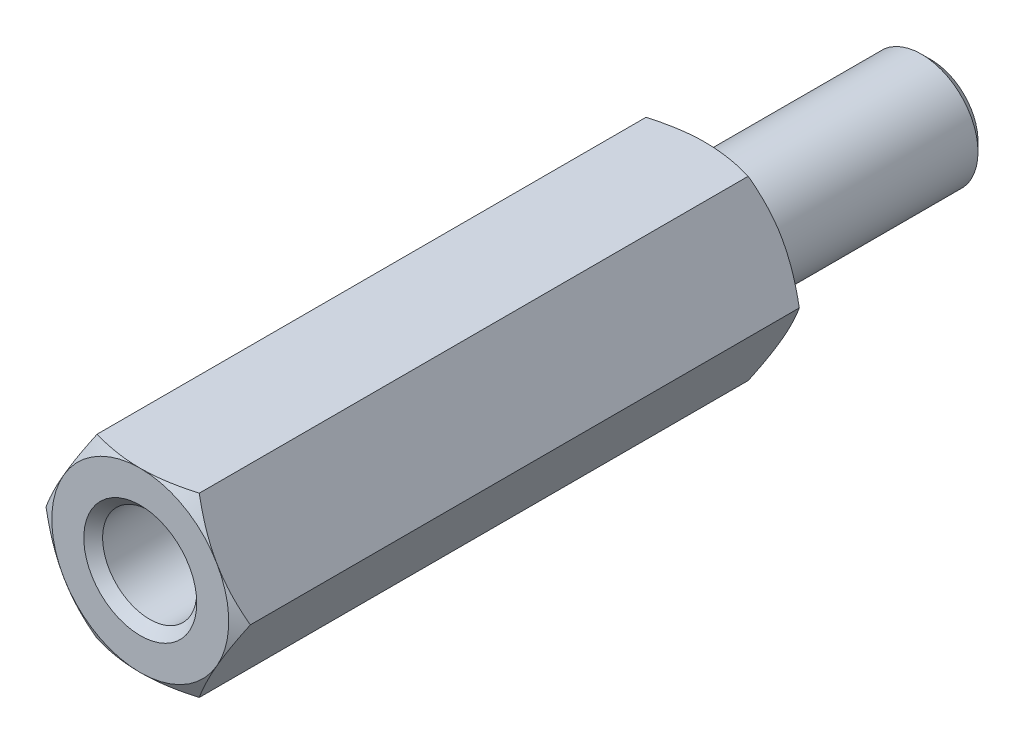
ISO-10303-21;
HEADER;
FILE_DESCRIPTION(('STEP AP214'),'2;1');
FILE_NAME('part.step','',(''),(''),'','','');
FILE_SCHEMA(('AUTOMOTIVE_DESIGN { 1 0 10303 214 1 1 1 1 }'));
ENDSEC;
DATA;
#1=APPLICATION_CONTEXT('core data for automotive mechanical design processes');
#2=APPLICATION_PROTOCOL_DEFINITION('international standard','automotive_design',2000,#1);
#3=PRODUCT_CONTEXT('',#1,'mechanical');
#4=PRODUCT('Part','Part','',(#3));
#5=PRODUCT_RELATED_PRODUCT_CATEGORY('part','',(#4));
#6=PRODUCT_DEFINITION_FORMATION('','',#4);
#7=PRODUCT_DEFINITION_CONTEXT('part definition',#1,'design');
#8=PRODUCT_DEFINITION('design','',#6,#7);
#9=PRODUCT_DEFINITION_SHAPE('','',#8);
#10=(LENGTH_UNIT() NAMED_UNIT(*) SI_UNIT(.MILLI.,.METRE.));
#11=(NAMED_UNIT(*) PLANE_ANGLE_UNIT() SI_UNIT($,.RADIAN.));
#12=(NAMED_UNIT(*) SI_UNIT($,.STERADIAN.) SOLID_ANGLE_UNIT());
#13=UNCERTAINTY_MEASURE_WITH_UNIT(LENGTH_MEASURE(1.E-05),#10,'distance_accuracy_value','');
#14=(GEOMETRIC_REPRESENTATION_CONTEXT(3) GLOBAL_UNCERTAINTY_ASSIGNED_CONTEXT((#13)) GLOBAL_UNIT_ASSIGNED_CONTEXT((#10,
#11,#12)) REPRESENTATION_CONTEXT('',''));
#15=CARTESIAN_POINT('',(0.,0.,0.));
#16=DIRECTION('',(0.,0.,1.));
#17=DIRECTION('',(1.,0.,0.));
#18=AXIS2_PLACEMENT_3D('',#15,#16,#17);
#19=CARTESIAN_POINT('',(0.,0.,15.));
#20=DIRECTION('',(0.,0.,1.));
#21=DIRECTION('',(1.,0.,0.));
#22=AXIS2_PLACEMENT_3D('',#19,#20,#21);
#23=CONICAL_SURFACE('',#22,1.5,0.785398163397448);
#24=CARTESIAN_POINT('',(0.,0.,15.));
#25=DIRECTION('',(0.,0.,-1.));
#26=DIRECTION('',(1.,0.,0.));
#27=AXIS2_PLACEMENT_3D('',#24,#25,#26);
#28=CIRCLE('',#27,1.5);
#29=CARTESIAN_POINT('',(1.5,0.,15.));
#30=VERTEX_POINT('',#29);
#31=EDGE_CURVE('E735',#30,#30,#28,.T.);
#32=ORIENTED_EDGE('',*,*,#31,.F.);
#33=EDGE_LOOP('',(#32));
#34=FACE_BOUND('',#33,.T.);
#35=CARTESIAN_POINT('',(0.,0.,14.75));
#36=DIRECTION('',(0.,0.,1.));
#37=DIRECTION('',(1.,0.,0.));
#38=AXIS2_PLACEMENT_3D('',#35,#36,#37);
#39=CIRCLE('',#38,1.25);
#40=CARTESIAN_POINT('',(1.25,0.,14.75));
#41=VERTEX_POINT('',#40);
#42=EDGE_CURVE('E11',#41,#41,#39,.T.);
#43=ORIENTED_EDGE('',*,*,#42,.F.);
#44=EDGE_LOOP('',(#43));
#45=FACE_BOUND('',#44,.T.);
#46=ADVANCED_FACE('F16',(#34,#45),#23,.F.);
#47=CARTESIAN_POINT('',(0.,0.,15.));
#48=DIRECTION('',(0.,0.,-1.));
#49=DIRECTION('',(0.,-1.,0.));
#50=AXIS2_PLACEMENT_3D('',#47,#48,#49);
#51=CYLINDRICAL_SURFACE('',#50,1.25);
#52=CARTESIAN_POINT('',(0.,0.,7.));
#53=DIRECTION('',(0.,0.,1.));
#54=DIRECTION('',(0.,-1.,0.));
#55=AXIS2_PLACEMENT_3D('',#52,#53,#54);
#56=CIRCLE('',#55,1.25);
#57=CARTESIAN_POINT('',(0.,-1.25,7.));
#58=VERTEX_POINT('',#57);
#59=EDGE_CURVE('E27',#58,#58,#56,.T.);
#60=ORIENTED_EDGE('',*,*,#59,.F.);
#61=EDGE_LOOP('',(#60));
#62=FACE_BOUND('',#61,.T.);
#63=ORIENTED_EDGE('',*,*,#42,.T.);
#64=EDGE_LOOP('',(#63));
#65=FACE_BOUND('',#64,.T.);
#66=ADVANCED_FACE('F831',(#62,#65),#51,.F.);
#67=CARTESIAN_POINT('',(0.,0.,7.));
#68=DIRECTION('',(0.,0.,-1.));
#69=DIRECTION('',(0.,-1.,0.));
#70=AXIS2_PLACEMENT_3D('',#67,#68,#69);
#71=PLANE('',#70);
#72=ORIENTED_EDGE('',*,*,#59,.T.);
#73=EDGE_LOOP('',(#72));
#74=FACE_BOUND('',#73,.T.);
#75=ADVANCED_FACE('F836',(#74),#71,.F.);
#76=CARTESIAN_POINT('',(0.,0.,0.));
#77=DIRECTION('',(0.,0.,1.));
#78=DIRECTION('',(1.,0.,0.));
#79=AXIS2_PLACEMENT_3D('',#76,#77,#78);
#80=PLANE('',#79);
#81=CARTESIAN_POINT('',(0.,0.,0.));
#82=DIRECTION('',(0.,0.,1.));
#83=DIRECTION('',(1.,0.,0.));
#84=AXIS2_PLACEMENT_3D('',#81,#82,#83);
#85=CIRCLE('',#84,2.35);
#86=CARTESIAN_POINT('',(2.03515969889343,1.175,0.));
#87=VERTEX_POINT('',#86);
#88=CARTESIAN_POINT('',(0.,2.35,0.));
#89=VERTEX_POINT('',#88);
#90=EDGE_CURVE('E512',#87,#89,#85,.T.);
#91=ORIENTED_EDGE('',*,*,#90,.F.);
#92=CARTESIAN_POINT('',(0.,0.,0.));
#93=DIRECTION('',(0.,0.,1.));
#94=DIRECTION('',(1.,0.,0.));
#95=AXIS2_PLACEMENT_3D('',#92,#93,#94);
#96=CIRCLE('',#95,2.35);
#97=CARTESIAN_POINT('',(2.03515969889343,-1.175,0.));
#98=VERTEX_POINT('',#97);
#99=EDGE_CURVE('E520',#98,#87,#96,.T.);
#100=ORIENTED_EDGE('',*,*,#99,.F.);
#101=CARTESIAN_POINT('',(0.,0.,0.));
#102=DIRECTION('',(0.,0.,1.));
#103=DIRECTION('',(1.,0.,0.));
#104=AXIS2_PLACEMENT_3D('',#101,#102,#103);
#105=CIRCLE('',#104,2.35);
#106=CARTESIAN_POINT('',(0.,-2.35,0.));
#107=VERTEX_POINT('',#106);
#108=EDGE_CURVE('E587',#107,#98,#105,.T.);
#109=ORIENTED_EDGE('',*,*,#108,.F.);
#110=CARTESIAN_POINT('',(0.,0.,0.));
#111=DIRECTION('',(0.,0.,1.));
#112=DIRECTION('',(1.,0.,0.));
#113=AXIS2_PLACEMENT_3D('',#110,#111,#112);
#114=CIRCLE('',#113,2.35);
#115=CARTESIAN_POINT('',(-2.03515969889343,-1.175,0.));
#116=VERTEX_POINT('',#115);
#117=EDGE_CURVE('E168',#116,#107,#114,.T.);
#118=ORIENTED_EDGE('',*,*,#117,.F.);
#119=CARTESIAN_POINT('',(0.,0.,0.));
#120=DIRECTION('',(0.,0.,1.));
#121=DIRECTION('',(1.,0.,0.));
#122=AXIS2_PLACEMENT_3D('',#119,#120,#121);
#123=CIRCLE('',#122,2.35);
#124=CARTESIAN_POINT('',(-2.03515969889343,1.175,0.));
#125=VERTEX_POINT('',#124);
#126=EDGE_CURVE('E600',#125,#116,#123,.T.);
#127=ORIENTED_EDGE('',*,*,#126,.F.);
#128=CARTESIAN_POINT('',(0.,0.,0.));
#129=DIRECTION('',(0.,0.,1.));
#130=DIRECTION('',(1.,0.,0.));
#131=AXIS2_PLACEMENT_3D('',#128,#129,#130);
#132=CIRCLE('',#131,2.35);
#133=EDGE_CURVE('E521',#89,#125,#132,.T.);
#134=ORIENTED_EDGE('',*,*,#133,.F.);
#135=EDGE_LOOP('',(#91,#100,#109,#118,#127,#134));
#136=FACE_BOUND('',#135,.T.);
#137=CARTESIAN_POINT('',(0.,0.,0.));
#138=DIRECTION('',(0.,0.,-1.));
#139=DIRECTION('',(1.,0.,0.));
#140=AXIS2_PLACEMENT_3D('',#137,#138,#139);
#141=CIRCLE('',#140,1.5);
#142=CARTESIAN_POINT('',(1.5,0.,0.));
#143=VERTEX_POINT('',#142);
#144=EDGE_CURVE('E686',#143,#143,#141,.T.);
#145=ORIENTED_EDGE('',*,*,#144,.F.);
#146=EDGE_LOOP('',(#145));
#147=FACE_BOUND('',#146,.T.);
#148=ADVANCED_FACE('F647',(#136,#147),#80,.F.);
#149=CARTESIAN_POINT('',(0.,0.,-6.));
#150=DIRECTION('',(0.,0.,1.));
#151=DIRECTION('',(1.,0.,0.));
#152=AXIS2_PLACEMENT_3D('',#149,#150,#151);
#153=CYLINDRICAL_SURFACE('',#152,1.5);
#154=ORIENTED_EDGE('',*,*,#144,.T.);
#155=EDGE_LOOP('',(#154));
#156=FACE_BOUND('',#155,.T.);
#157=CARTESIAN_POINT('',(0.,0.,-5.75));
#158=DIRECTION('',(0.,0.,1.));
#159=DIRECTION('',(-1.,0.,0.));
#160=AXIS2_PLACEMENT_3D('',#157,#158,#159);
#161=CIRCLE('',#160,1.5);
#162=CARTESIAN_POINT('',(-1.5,0.,-5.75));
#163=VERTEX_POINT('',#162);
#164=EDGE_CURVE('E689',#163,#163,#161,.T.);
#165=ORIENTED_EDGE('',*,*,#164,.T.);
#166=EDGE_LOOP('',(#165));
#167=FACE_BOUND('',#166,.T.);
#168=ADVANCED_FACE('F846',(#156,#167),#153,.T.);
#169=CARTESIAN_POINT('',(0.,0.,-6.));
#170=DIRECTION('',(0.,0.,1.));
#171=DIRECTION('',(1.,0.,0.));
#172=AXIS2_PLACEMENT_3D('',#169,#170,#171);
#173=CONICAL_SURFACE('',#172,1.25,0.785398163397448);
#174=CARTESIAN_POINT('',(0.,0.,-6.));
#175=DIRECTION('',(0.,0.,-1.));
#176=DIRECTION('',(-1.,0.,0.));
#177=AXIS2_PLACEMENT_3D('',#174,#175,#176);
#178=CIRCLE('',#177,1.25);
#179=CARTESIAN_POINT('',(-1.25,0.,-6.));
#180=VERTEX_POINT('',#179);
#181=EDGE_CURVE('E595',#180,#180,#178,.T.);
#182=ORIENTED_EDGE('',*,*,#181,.F.);
#183=EDGE_LOOP('',(#182));
#184=FACE_BOUND('',#183,.T.);
#185=ORIENTED_EDGE('',*,*,#164,.F.);
#186=EDGE_LOOP('',(#185));
#187=FACE_BOUND('',#186,.T.);
#188=ADVANCED_FACE('F848',(#184,#187),#173,.T.);
#189=CARTESIAN_POINT('',(0.,0.,-6.));
#190=DIRECTION('',(0.,0.,-1.));
#191=DIRECTION('',(0.,-1.,0.));
#192=AXIS2_PLACEMENT_3D('',#189,#190,#191);
#193=PLANE('',#192);
#194=ORIENTED_EDGE('',*,*,#181,.T.);
#195=EDGE_LOOP('',(#194));
#196=FACE_BOUND('',#195,.T.);
#197=ADVANCED_FACE('F578',(#196),#193,.T.);
#198=CARTESIAN_POINT('',(0.,0.,0.));
#199=DIRECTION('',(0.,0.,1.));
#200=DIRECTION('',(1.,0.,0.));
#201=AXIS2_PLACEMENT_3D('',#198,#199,#200);
#202=CONICAL_SURFACE('',#201,2.35,1.0471975511966);
#203=ORIENTED_EDGE('',*,*,#108,.T.);
#204=CARTESIAN_POINT('',(1.35677313259551,-2.35000000000019,0.209893534069571));
#205=CARTESIAN_POINT('',(1.72031939778416,-1.72031939779154,0.));
#206=CARTESIAN_POINT('',(2.03515969889343,-1.175,0.));
#207=B_SPLINE_CURVE_WITH_KNOTS('',2,(#204,#205,#206),.UNSPECIFIED.,.F.,.F.,(3,3),(0.,1.),.UNSPECIFIED.);
#208=CARTESIAN_POINT('',(1.35677313259562,-2.35,0.209893534071045));
#209=VERTEX_POINT('',#208);
#210=EDGE_CURVE('E556',#209,#98,#207,.T.);
#211=ORIENTED_EDGE('',*,*,#210,.F.);
#212=CARTESIAN_POINT('',(0.,-2.35,0.));
#213=CARTESIAN_POINT('',(0.629680602213305,-2.35,0.));
#214=CARTESIAN_POINT('',(1.35677313259563,-2.35,0.209893534071));
#215=B_SPLINE_CURVE_WITH_KNOTS('',2,(#212,#213,#214),.UNSPECIFIED.,.F.,.F.,(3,3),(0.,1.),.UNSPECIFIED.);
#216=EDGE_CURVE('E173',#107,#209,#215,.T.);
#217=ORIENTED_EDGE('',*,*,#216,.F.);
#218=EDGE_LOOP('',(#203,#211,#217));
#219=FACE_BOUND('',#218,.T.);
#220=ADVANCED_FACE('F569',(#219),#202,.T.);
#221=CARTESIAN_POINT('',(0.,0.,0.));
#222=DIRECTION('',(0.,0.,1.));
#223=DIRECTION('',(1.,0.,0.));
#224=AXIS2_PLACEMENT_3D('',#221,#222,#223);
#225=CONICAL_SURFACE('',#224,2.35,1.0471975511966);
#226=ORIENTED_EDGE('',*,*,#99,.T.);
#227=CARTESIAN_POINT('',(2.71354626519135,-1.81776656334133E-13,0.209893534069585));
#228=CARTESIAN_POINT('',(2.35000000000271,0.629680602208454,0.));
#229=CARTESIAN_POINT('',(2.03515969889343,1.175,0.));
#230=B_SPLINE_CURVE_WITH_KNOTS('',2,(#227,#228,#229),.UNSPECIFIED.,.F.,.F.,(3,3),(0.,1.),.UNSPECIFIED.);
#231=CARTESIAN_POINT('',(2.71354626519124,0.,0.209893534071045));
#232=VERTEX_POINT('',#231);
#233=EDGE_CURVE('E532',#232,#87,#230,.T.);
#234=ORIENTED_EDGE('',*,*,#233,.F.);
#235=CARTESIAN_POINT('',(2.03515969889343,-1.175,0.));
#236=CARTESIAN_POINT('',(2.35000000000138,-0.62968060221074,0.));
#237=CARTESIAN_POINT('',(2.7135462651913,1.06251812903579E-13,0.209893534070291));
#238=B_SPLINE_CURVE_WITH_KNOTS('',2,(#235,#236,#237),.UNSPECIFIED.,.F.,.F.,(3,3),(0.,1.),.UNSPECIFIED.);
#239=EDGE_CURVE('E174',#98,#232,#238,.T.);
#240=ORIENTED_EDGE('',*,*,#239,.F.);
#241=EDGE_LOOP('',(#226,#234,#240));
#242=FACE_BOUND('',#241,.T.);
#243=ADVANCED_FACE('F503',(#242),#225,.T.);
#244=CARTESIAN_POINT('',(0.,0.,0.));
#245=DIRECTION('',(0.,0.,1.));
#246=DIRECTION('',(1.,0.,0.));
#247=AXIS2_PLACEMENT_3D('',#244,#245,#246);
#248=CONICAL_SURFACE('',#247,2.35,1.0471975511966);
#249=ORIENTED_EDGE('',*,*,#90,.T.);
#250=CARTESIAN_POINT('',(1.35677313259561,2.35,0.209893534071031));
#251=CARTESIAN_POINT('',(0.6296806022132,2.35,0.));
#252=CARTESIAN_POINT('',(0.,2.35,0.));
#253=B_SPLINE_CURVE_WITH_KNOTS('',2,(#250,#251,#252),.UNSPECIFIED.,.F.,.F.,(3,3),(0.,1.),.UNSPECIFIED.);
#254=CARTESIAN_POINT('',(1.35677313259561,2.35,0.209893534071045));
#255=VERTEX_POINT('',#254);
#256=EDGE_CURVE('E489',#255,#89,#253,.T.);
#257=ORIENTED_EDGE('',*,*,#256,.F.);
#258=CARTESIAN_POINT('',(2.03515969889343,1.175,0.));
#259=CARTESIAN_POINT('',(1.72031939778547,1.72031939778927,0.));
#260=CARTESIAN_POINT('',(1.35677313259556,2.35000000000011,0.209893534070305));
#261=B_SPLINE_CURVE_WITH_KNOTS('',2,(#258,#259,#260),.UNSPECIFIED.,.F.,.F.,(3,3),(0.,1.),.UNSPECIFIED.);
#262=EDGE_CURVE('E533',#87,#255,#261,.T.);
#263=ORIENTED_EDGE('',*,*,#262,.F.);
#264=EDGE_LOOP('',(#249,#257,#263));
#265=FACE_BOUND('',#264,.T.);
#266=ADVANCED_FACE('F494',(#265),#248,.T.);
#267=CARTESIAN_POINT('',(0.,0.,0.));
#268=DIRECTION('',(0.,0.,1.));
#269=DIRECTION('',(1.,0.,0.));
#270=AXIS2_PLACEMENT_3D('',#267,#268,#269);
#271=CONICAL_SURFACE('',#270,2.35,1.0471975511966);
#272=ORIENTED_EDGE('',*,*,#133,.T.);
#273=CARTESIAN_POINT('',(-1.35677313259552,2.35000000000018,0.209893534069571));
#274=CARTESIAN_POINT('',(-1.72031939778415,1.72031939779155,0.));
#275=CARTESIAN_POINT('',(-2.03515969889343,1.175,0.));
#276=B_SPLINE_CURVE_WITH_KNOTS('',2,(#273,#274,#275),.UNSPECIFIED.,.F.,.F.,(3,3),(0.,1.),.UNSPECIFIED.);
#277=CARTESIAN_POINT('',(-1.35677313259562,2.35,0.209893534071045));
#278=VERTEX_POINT('',#277);
#279=EDGE_CURVE('E656',#278,#125,#276,.T.);
#280=ORIENTED_EDGE('',*,*,#279,.F.);
#281=CARTESIAN_POINT('',(0.,2.35,0.));
#282=CARTESIAN_POINT('',(-0.629680602213305,2.35,0.));
#283=CARTESIAN_POINT('',(-1.35677313259563,2.35,0.209893534071011));
#284=B_SPLINE_CURVE_WITH_KNOTS('',2,(#281,#282,#283),.UNSPECIFIED.,.F.,.F.,(3,3),(0.,1.),.UNSPECIFIED.);
#285=EDGE_CURVE('E542',#89,#278,#284,.T.);
#286=ORIENTED_EDGE('',*,*,#285,.F.);
#287=EDGE_LOOP('',(#272,#280,#286));
#288=FACE_BOUND('',#287,.T.);
#289=ADVANCED_FACE('F330',(#288),#271,.T.);
#290=CARTESIAN_POINT('',(0.,0.,0.));
#291=DIRECTION('',(0.,0.,1.));
#292=DIRECTION('',(1.,0.,0.));
#293=AXIS2_PLACEMENT_3D('',#290,#291,#292);
#294=CONICAL_SURFACE('',#293,2.35,1.0471975511966);
#295=ORIENTED_EDGE('',*,*,#126,.T.);
#296=CARTESIAN_POINT('',(-2.71354626519134,1.76378261404584E-13,0.209893534069571));
#297=CARTESIAN_POINT('',(-2.3500000000027,-0.629680602208452,0.));
#298=CARTESIAN_POINT('',(-2.03515969889343,-1.175,0.));
#299=B_SPLINE_CURVE_WITH_KNOTS('',2,(#296,#297,#298),.UNSPECIFIED.,.F.,.F.,(3,3),(0.,1.),.UNSPECIFIED.);
#300=CARTESIAN_POINT('',(-2.71354626519124,0.,0.209893534071045));
#301=VERTEX_POINT('',#300);
#302=EDGE_CURVE('E192',#301,#116,#299,.T.);
#303=ORIENTED_EDGE('',*,*,#302,.F.);
#304=CARTESIAN_POINT('',(-2.03515969889343,1.175,0.));
#305=CARTESIAN_POINT('',(-2.35000000000139,0.629680602210734,0.));
#306=CARTESIAN_POINT('',(-2.7135462651913,-1.07986536379556E-13,0.2098935340703));
#307=B_SPLINE_CURVE_WITH_KNOTS('',2,(#304,#305,#306),.UNSPECIFIED.,.F.,.F.,(3,3),(0.,1.),.UNSPECIFIED.);
#308=EDGE_CURVE('E527',#125,#301,#307,.T.);
#309=ORIENTED_EDGE('',*,*,#308,.F.);
#310=EDGE_LOOP('',(#295,#303,#309));
#311=FACE_BOUND('',#310,.T.);
#312=ADVANCED_FACE('F277',(#311),#294,.T.);
#313=CARTESIAN_POINT('',(0.,0.,0.));
#314=DIRECTION('',(0.,0.,1.));
#315=DIRECTION('',(1.,0.,0.));
#316=AXIS2_PLACEMENT_3D('',#313,#314,#315);
#317=CONICAL_SURFACE('',#316,2.35,1.0471975511966);
#318=CARTESIAN_POINT('',(-2.03515969889343,-1.175,0.));
#319=CARTESIAN_POINT('',(-1.72031939778547,-1.72031939778927,0.));
#320=CARTESIAN_POINT('',(-1.35677313259556,-2.35000000000011,0.209893534070291));
#321=B_SPLINE_CURVE_WITH_KNOTS('',2,(#318,#319,#320),.UNSPECIFIED.,.F.,.F.,(3,3),(0.,1.),.UNSPECIFIED.);
#322=CARTESIAN_POINT('',(-1.35677313259562,-2.35,0.209893534071047));
#323=VERTEX_POINT('',#322);
#324=EDGE_CURVE('E164',#116,#323,#321,.T.);
#325=ORIENTED_EDGE('',*,*,#324,.F.);
#326=ORIENTED_EDGE('',*,*,#117,.T.);
#327=CARTESIAN_POINT('',(-1.35677313259562,-2.35,0.209893534071031));
#328=CARTESIAN_POINT('',(-0.629680602213206,-2.35,0.));
#329=CARTESIAN_POINT('',(0.,-2.35,0.));
#330=B_SPLINE_CURVE_WITH_KNOTS('',2,(#327,#328,#329),.UNSPECIFIED.,.F.,.F.,(3,3),(0.,1.),.UNSPECIFIED.);
#331=EDGE_CURVE('E159',#323,#107,#330,.T.);
#332=ORIENTED_EDGE('',*,*,#331,.F.);
#333=EDGE_LOOP('',(#325,#326,#332));
#334=FACE_BOUND('',#333,.T.);
#335=ADVANCED_FACE('F162',(#334),#317,.T.);
#336=CARTESIAN_POINT('',(-1.35677313259562,-2.35,5.));
#337=DIRECTION('',(0.,1.,0.));
#338=DIRECTION('',(1.,0.,0.));
#339=AXIS2_PLACEMENT_3D('',#336,#337,#338);
#340=PLANE('',#339);
#341=DIRECTION('',(0.,0.,-1.));
#342=VECTOR('',#341,1.);
#343=CARTESIAN_POINT('',(-1.35677313259562,-2.35,5.));
#344=LINE('',#343,#342);
#345=CARTESIAN_POINT('',(-1.35677313259562,-2.35,14.790106465929));
#346=VERTEX_POINT('',#345);
#347=EDGE_CURVE('E178',#346,#323,#344,.T.);
#348=ORIENTED_EDGE('',*,*,#347,.T.);
#349=ORIENTED_EDGE('',*,*,#331,.T.);
#350=ORIENTED_EDGE('',*,*,#216,.T.);
#351=DIRECTION('',(0.,0.,-1.));
#352=VECTOR('',#351,1.);
#353=CARTESIAN_POINT('',(1.35677313259562,-2.35,5.));
#354=LINE('',#353,#352);
#355=CARTESIAN_POINT('',(1.35677313259562,-2.35,14.790106465929));
#356=VERTEX_POINT('',#355);
#357=EDGE_CURVE('E541',#356,#209,#354,.T.);
#358=ORIENTED_EDGE('',*,*,#357,.F.);
#359=CARTESIAN_POINT('',(0.,-2.35,15.));
#360=CARTESIAN_POINT('',(0.0569898805085818,-2.34998223790604,15.0000198621487));
#361=CARTESIAN_POINT('',(0.113979066153858,-2.34994616675174,14.9988345049703));
#362=CARTESIAN_POINT('',(0.227671429761785,-2.34989447859525,14.9940974313157));
#363=CARTESIAN_POINT('',(0.284374931900596,-2.34987879470469,14.9905535111894));
#364=CARTESIAN_POINT('',(0.398067480440072,-2.34992428082444,14.9811031222581));
#365=CARTESIAN_POINT('',(0.455054871097415,-2.34998610363658,14.975176875291));
#366=CARTESIAN_POINT('',(0.569866021918259,-2.35010138084254,14.9610034884358));
#367=CARTESIAN_POINT('',(0.627684426821159,-2.35015464858288,14.9527133521143));
#368=CARTESIAN_POINT('',(0.740520305213578,-2.35016236737531,14.9344713747374));
#369=CARTESIAN_POINT('',(0.795551814923057,-2.35012094711114,14.9246057630553));
#370=CARTESIAN_POINT('',(0.906033500923337,-2.35005435744373,14.9029375031044));
#371=CARTESIAN_POINT('',(0.961478714889878,-2.35002942425149,14.8911096146164));
#372=CARTESIAN_POINT('',(1.07310299823894,-2.34999878788455,14.8655358608681));
#373=CARTESIAN_POINT('',(1.12927423957828,-2.34999348370669,14.8517560519232));
#374=CARTESIAN_POINT('',(1.24263204165423,-2.34999227207601,14.8222834514747));
#375=CARTESIAN_POINT('',(1.29980833846896,-2.34999660573884,14.8065510839247));
#376=CARTESIAN_POINT('',(1.35677313259561,-2.34999999999997,14.790106465929));
#377=B_SPLINE_CURVE_WITH_KNOTS('',3,(#359,#360,#361,#362,#363,#364,#365,#366,#367,#368,#369,
#370,#371,#372,#373,#374,#375,#376),.UNSPECIFIED.,.F.,.F.,(4,2,2,2,2,2,2,2,4),(0.,
0.170955523729223,0.34134873358799,0.513186773818304,0.688375037220441,0.856070990715303,
1.02612027923544,1.19960772903592,1.3774841124385),.UNSPECIFIED.);
#378=CARTESIAN_POINT('',(0.,-2.35,15.));
#379=VERTEX_POINT('',#378);
#380=EDGE_CURVE('E681',#379,#356,#377,.T.);
#381=ORIENTED_EDGE('',*,*,#380,.F.);
#382=CARTESIAN_POINT('',(-1.35677313259561,-2.34999999999998,14.790106465929));
#383=CARTESIAN_POINT('',(-1.29981478304855,-2.34999664305614,14.806549214638));
#384=CARTESIAN_POINT('',(-1.24264490927598,-2.34999289152531,14.8222796016959));
#385=CARTESIAN_POINT('',(-1.12929545948309,-2.34999554718112,14.8517496514687));
#386=CARTESIAN_POINT('',(-1.07312611444837,-2.35000170675881,14.8655287635228));
#387=CARTESIAN_POINT('',(-0.961501458691434,-2.35003359497319,14.8911024366567));
#388=CARTESIAN_POINT('',(-0.906053944968671,-2.35005893485502,14.9029308079662));
#389=CARTESIAN_POINT('',(-0.795563946580114,-2.35012425670273,14.9246017739758));
#390=CARTESIAN_POINT('',(-0.740526396783754,-2.35016403226208,14.9344694678709));
#391=CARTESIAN_POINT('',(-0.627690730564334,-2.35015291056097,14.9527132960362));
#392=CARTESIAN_POINT('',(-0.569878646917285,-2.35009790445374,14.9610036376061));
#393=CARTESIAN_POINT('',(-0.455075905809175,-2.34998135958573,14.9751772222369));
#394=CARTESIAN_POINT('',(-0.398090586710543,-2.34991996527371,14.9811033215988));
#395=CARTESIAN_POINT('',(-0.284398021611257,-2.34987579485824,14.990553658474));
#396=CARTESIAN_POINT('',(-0.227692417034037,-2.34989236770654,14.9940975047175));
#397=CARTESIAN_POINT('',(-0.113991655127477,-2.34994553451344,14.9988346058795));
#398=CARTESIAN_POINT('',(-0.0569961663689094,-2.34998219583293,15.0000198897594));
#399=CARTESIAN_POINT('',(0.,-2.35,15.));
#400=B_SPLINE_CURVE_WITH_KNOTS('',3,(#382,#383,#384,#385,#386,#387,#388,#389,#390,#391,#392,
#393,#394,#395,#396,#397,#398,#399),.UNSPECIFIED.,.F.,.F.,(4,2,2,2,2,2,2,2,4),(0.,
0.17785623759356,0.351337661723348,0.521394024583748,0.689108930252408,0.864278498719589,
1.0361102777329,1.20650977089324,1.37748417764025),.UNSPECIFIED.);
#401=EDGE_CURVE('E181',#346,#379,#400,.T.);
#402=ORIENTED_EDGE('',*,*,#401,.F.);
#403=EDGE_LOOP('',(#348,#349,#350,#358,#381,#402));
#404=FACE_BOUND('',#403,.T.);
#405=ADVANCED_FACE('F179',(#404),#340,.F.);
#406=CARTESIAN_POINT('',(1.35677313259562,-2.35,5.));
#407=DIRECTION('',(-0.86602540378444,0.5,0.));
#408=DIRECTION('',(0.,0.,1.));
#409=AXIS2_PLACEMENT_3D('',#406,#407,#408);
#410=PLANE('',#409);
#411=ORIENTED_EDGE('',*,*,#357,.T.);
#412=ORIENTED_EDGE('',*,*,#210,.T.);
#413=ORIENTED_EDGE('',*,*,#239,.T.);
#414=DIRECTION('',(0.,0.,-1.));
#415=VECTOR('',#414,1.);
#416=CARTESIAN_POINT('',(2.71354626519124,0.,5.));
#417=LINE('',#416,#415);
#418=CARTESIAN_POINT('',(2.71354626519124,0.,14.790106465929));
#419=VERTEX_POINT('',#418);
#420=EDGE_CURVE('E534',#419,#232,#417,.T.);
#421=ORIENTED_EDGE('',*,*,#420,.F.);
#422=CARTESIAN_POINT('',(2.03515969889343,-1.17499999999999,15.));
#423=CARTESIAN_POINT('',(2.06363925672343,-1.12563643467339,15.0000198621487));
#424=CARTESIAN_POINT('',(2.09210261101037,-1.07626431658587,14.9988345049703));
#425=CARTESIAN_POINT('',(2.14890402955803,-0.977777997406067,14.9940974313157));
#426=CARTESIAN_POINT('',(2.1772421979798,-0.928663482124803,14.9905535111894));
#427=CARTESIAN_POINT('',(2.23412786438466,-0.830225589928433,14.9811031222581));
#428=CARTESIAN_POINT('',(2.26267509983904,-0.780903973330015,14.9751768752911));
#429=CARTESIAN_POINT('',(2.32018050823798,-0.681532238685206,14.9610034884358));
#430=CARTESIAN_POINT('',(2.3491358419056,-0.631486665103802,14.9527133521143));
#431=CARTESIAN_POINT('',(2.40556046577243,-0.53377178735404,14.9344713747372));
#432=CARTESIAN_POINT('',(2.43304034962662,-0.486092391804497,14.9246057630549));
#433=CARTESIAN_POINT('',(2.48822352428367,-0.390379150240952,14.9029375031038));
#434=CARTESIAN_POINT('',(2.51592453848915,-0.342349719831325,14.8911096146156));
#435=CARTESIAN_POINT('',(2.57171014829154,-0.245664936588237,14.8655358608673));
#436=CARTESIAN_POINT('',(2.59979117540827,-0.197016562537457,14.8517560519225));
#437=CARTESIAN_POINT('',(2.65646902714276,-0.0988452204078284,14.8222834514743));
#438=CARTESIAN_POINT('',(2.68506092861185,-0.0493312617038977,14.8065510839245));
#439=CARTESIAN_POINT('',(2.71354626519122,0.,14.790106465929));
#440=B_SPLINE_CURVE_WITH_KNOTS('',3,(#422,#423,#424,#425,#426,#427,#428,#429,#430,#431,#432,
#433,#434,#435,#436,#437,#438,#439),.UNSPECIFIED.,.F.,.F.,(4,2,2,2,2,2,2,2,4),(0.,
0.170955523731108,0.341348733590504,0.513186773820192,0.688375037220462,0.856070990717223,
1.02612027923806,1.19960772903794,1.37748411243852),.UNSPECIFIED.);
#441=CARTESIAN_POINT('',(2.03515969889343,-1.175,15.));
#442=VERTEX_POINT('',#441);
#443=EDGE_CURVE('E401',#442,#419,#440,.T.);
#444=ORIENTED_EDGE('',*,*,#443,.F.);
#445=CARTESIAN_POINT('',(1.35677313259561,-2.34999999999998,14.790106465929));
#446=CARTESIAN_POINT('',(1.38524940017073,-2.30067094386226,14.8065492146382));
#447=CARTESIAN_POINT('',(1.41383108813622,-2.25115850507822,14.8222796016962));
#448=CARTESIAN_POINT('',(1.47050811289827,-2.15299632987991,14.8517496514691));
#449=CARTESIAN_POINT('',(1.4985981197664,-2.10435532995461,14.8655287635233));
#450=CARTESIAN_POINT('',(1.55443806364851,-2.00770148648757,14.8911024366573));
#451=CARTESIAN_POINT('',(1.58218376549118,-1.95969520096802,14.9029308079667));
#452=CARTESIAN_POINT('',(1.63748533506477,-1.86404071642386,14.924601773976));
#453=CARTESIAN_POINT('',(1.66503855660767,-1.81639668791827,14.9344694678711));
#454=CARTESIAN_POINT('',(1.72144675804191,-1.71867257366887,14.9527132960362));
#455=CARTESIAN_POINT('',(1.75030516317956,-1.66857833753087,14.9610036376061));
#456=CARTESIAN_POINT('',(1.80760560291762,-1.56909797487266,14.9751772222369));
#457=CARTESIAN_POINT('',(1.83604509343312,-1.51971654373432,14.9811033215988));
#458=CARTESIAN_POINT('',(1.89285312328079,-1.42123380892914,14.9905536584739));
#459=CARTESIAN_POINT('',(1.92122027807691,-1.37213360125256,14.9940975047175));
#460=CARTESIAN_POINT('',(1.9781167028352,-1.27369243641577,14.9988346058795));
#461=CARTESIAN_POINT('',(2.00664619684823,-1.22435122590986,15.0000198897594));
#462=CARTESIAN_POINT('',(2.03515969889343,-1.17499999999999,15.));
#463=B_SPLINE_CURVE_WITH_KNOTS('',3,(#445,#446,#447,#448,#449,#450,#451,#452,#453,#454,#455,
#456,#457,#458,#459,#460,#461,#462),.UNSPECIFIED.,.F.,.F.,(4,2,2,2,2,2,2,2,4),(0.,
0.177856237595033,0.351337661725265,0.521394024585147,0.689108930252417,0.864278498720967,
1.03611027773474,1.20650977089462,1.37748417764024),.UNSPECIFIED.);
#464=EDGE_CURVE('E677',#356,#442,#463,.T.);
#465=ORIENTED_EDGE('',*,*,#464,.F.);
#466=EDGE_LOOP('',(#411,#412,#413,#421,#444,#465));
#467=FACE_BOUND('',#466,.T.);
#468=ADVANCED_FACE('F359',(#467),#410,.F.);
#469=CARTESIAN_POINT('',(2.71354626519124,0.,5.));
#470=DIRECTION('',(-0.866025403784437,-0.5,0.));
#471=DIRECTION('',(-0.5,0.866025403784437,0.));
#472=AXIS2_PLACEMENT_3D('',#469,#470,#471);
#473=PLANE('',#472);
#474=ORIENTED_EDGE('',*,*,#420,.T.);
#475=ORIENTED_EDGE('',*,*,#233,.T.);
#476=ORIENTED_EDGE('',*,*,#262,.T.);
#477=DIRECTION('',(0.,0.,-1.));
#478=VECTOR('',#477,1.);
#479=CARTESIAN_POINT('',(1.35677313259561,2.35,5.));
#480=LINE('',#479,#478);
#481=CARTESIAN_POINT('',(1.35677313259561,2.35,14.790106465929));
#482=VERTEX_POINT('',#481);
#483=EDGE_CURVE('E524',#482,#255,#480,.T.);
#484=ORIENTED_EDGE('',*,*,#483,.F.);
#485=CARTESIAN_POINT('',(2.03515969889343,1.175,15.));
#486=CARTESIAN_POINT('',(2.00664937621486,1.22434580323155,15.0000198621487));
#487=CARTESIAN_POINT('',(1.97812354485662,1.27368185016368,14.9988345049703));
#488=CARTESIAN_POINT('',(1.92123259979661,1.37211648118554,14.9940974313157));
#489=CARTESIAN_POINT('',(1.89286726607973,1.42121531257588,14.9905535111894));
#490=CARTESIAN_POINT('',(1.83606038394534,1.519698690892,14.9811031222581));
#491=CARTESIAN_POINT('',(1.80762022874244,1.56908213030292,14.975176875291));
#492=CARTESIAN_POINT('',(1.75031448632032,1.66856914215515,14.9610034884358));
#493=CARTESIAN_POINT('',(1.72145141508474,1.71866798347798,14.9527133521143));
#494=CARTESIAN_POINT('',(1.66504016055856,1.81639058002022,14.9344713747376));
#495=CARTESIAN_POINT('',(1.63748853470298,1.86402855530455,14.9246057630557));
#496=CARTESIAN_POINT('',(1.58219002335954,1.95967520719923,14.9029375031051));
#497=CARTESIAN_POINT('',(1.55444582359854,2.00767970441622,14.8911096146171));
#498=CARTESIAN_POINT('',(1.49860715005209,2.1043338512923,14.8655358608688));
#499=CARTESIAN_POINT('',(1.47051693582962,2.15297692116555,14.8517560519238));
#500=CARTESIAN_POINT('',(1.41383698548841,2.25114705166596,14.822283451475));
#501=CARTESIAN_POINT('',(1.38525259014288,2.30066534403384,14.8065510839249));
#502=CARTESIAN_POINT('',(1.3567731325956,2.34999999999999,14.790106465929));
#503=B_SPLINE_CURVE_WITH_KNOTS('',3,(#485,#486,#487,#488,#489,#490,#491,#492,#493,#494,#495,
#496,#497,#498,#499,#500,#501,#502),.UNSPECIFIED.,.F.,.F.,(4,2,2,2,2,2,2,2,4),(0.,
0.170955523727335,0.341348733585476,0.51318677381642,0.688375037220433,0.856070990713396,
1.02612027923282,1.19960772903391,1.37748411243852),.UNSPECIFIED.);
#504=CARTESIAN_POINT('',(2.03515969889343,1.175,15.));
#505=VERTEX_POINT('',#504);
#506=EDGE_CURVE('E450',#505,#482,#503,.T.);
#507=ORIENTED_EDGE('',*,*,#506,.F.);
#508=CARTESIAN_POINT('',(2.71354626519122,0.,14.790106465929));
#509=CARTESIAN_POINT('',(2.68506418321824,0.0493256991948436,14.8065492146385));
#510=CARTESIAN_POINT('',(2.65647599741004,0.0988343864489258,14.8222796016968));
#511=CARTESIAN_POINT('',(2.59980357237765,0.196999217304062,14.8517496514702));
#512=CARTESIAN_POINT('',(2.57172423421064,0.245646376807206,14.8655287635245));
#513=CARTESIAN_POINT('',(2.51593952233568,0.342332108488365,14.8911024366585));
#514=CARTESIAN_POINT('',(2.48823771045589,0.390363733889343,14.9029308079678));
#515=CARTESIAN_POINT('',(2.43304928164244,0.48608354028017,14.9246017739767));
#516=CARTESIAN_POINT('',(2.4055649533902,0.533767344344456,14.9344694678714));
#517=CARTESIAN_POINT('',(2.3491374886055,0.631480336893324,14.9527132960362));
#518=CARTESIAN_POINT('',(2.32018381009534,0.681519566925326,14.9610036376061));
#519=CARTESIAN_POINT('',(2.26268150872415,0.780883384716977,14.9751772222369));
#520=CARTESIAN_POINT('',(2.23413568014062,0.830203421543531,14.9811033215988));
#521=CARTESIAN_POINT('',(2.17725114488881,0.928641985933029,14.9905536584739));
#522=CARTESIAN_POINT('',(2.14891269510791,0.977758766457445,14.9940975047175));
#523=CARTESIAN_POINT('',(2.09210835796076,1.07625309809965,14.9988346058794));
#524=CARTESIAN_POINT('',(2.06364236321615,1.12563096992401,15.0000198897594));
#525=CARTESIAN_POINT('',(2.03515969889343,1.175,15.));
#526=B_SPLINE_CURVE_WITH_KNOTS('',3,(#508,#509,#510,#511,#512,#513,#514,#515,#516,#517,#518,
#519,#520,#521,#522,#523,#524,#525),.UNSPECIFIED.,.F.,.F.,(4,2,2,2,2,2,2,2,4),(0.,
0.177856237598517,0.351337661729792,0.521394024588451,0.689108930252444,0.86427849872422,
1.03611027773907,1.20650977089786,1.37748417764022),.UNSPECIFIED.);
#527=EDGE_CURVE('E685',#419,#505,#526,.T.);
#528=ORIENTED_EDGE('',*,*,#527,.F.);
#529=EDGE_LOOP('',(#474,#475,#476,#484,#507,#528));
#530=FACE_BOUND('',#529,.T.);
#531=ADVANCED_FACE('F350',(#530),#473,.F.);
#532=CARTESIAN_POINT('',(1.35677313259561,2.35,5.));
#533=DIRECTION('',(0.,-1.,0.));
#534=DIRECTION('',(0.,0.,-1.));
#535=AXIS2_PLACEMENT_3D('',#532,#533,#534);
#536=PLANE('',#535);
#537=ORIENTED_EDGE('',*,*,#483,.T.);
#538=ORIENTED_EDGE('',*,*,#256,.T.);
#539=ORIENTED_EDGE('',*,*,#285,.T.);
#540=DIRECTION('',(0.,0.,-1.));
#541=VECTOR('',#540,1.);
#542=CARTESIAN_POINT('',(-1.35677313259562,2.35,5.));
#543=LINE('',#542,#541);
#544=CARTESIAN_POINT('',(-1.35677313259562,2.35,14.790106465929));
#545=VERTEX_POINT('',#544);
#546=EDGE_CURVE('E186',#545,#278,#543,.T.);
#547=ORIENTED_EDGE('',*,*,#546,.F.);
#548=CARTESIAN_POINT('',(0.,2.35,15.));
#549=CARTESIAN_POINT('',(-0.0569898805079552,2.34998223790604,15.0000198621487));
#550=CARTESIAN_POINT('',(-0.1139790661526,2.3499461667518,14.9988345049703));
#551=CARTESIAN_POINT('',(-0.227671429759685,2.34989447859546,14.9940974313157));
#552=CARTESIAN_POINT('',(-0.284374931898285,2.34987879470499,14.9905535111894));
#553=CARTESIAN_POINT('',(-0.398067480437758,2.34992428082487,14.9811031222581));
#554=CARTESIAN_POINT('',(-0.455054871095309,2.34998610363706,14.975176875291));
#555=CARTESIAN_POINT('',(-0.569866021916995,2.35010138084289,14.9610034884358));
#556=CARTESIAN_POINT('',(-0.627684426820529,2.35015464858305,14.9527133521143));
#557=CARTESIAN_POINT('',(-0.74052030521297,2.35016236737514,14.9344713747376));
#558=CARTESIAN_POINT('',(-0.795551814921844,2.35012094711081,14.9246057630557));
#559=CARTESIAN_POINT('',(-0.906033500921292,2.35005435744327,14.9029375031051));
#560=CARTESIAN_POINT('',(-0.961478714887602,2.35002942425107,14.8911096146171));
#561=CARTESIAN_POINT('',(-1.07310299823663,2.34999878788426,14.8655358608688));
#562=CARTESIAN_POINT('',(-1.12927423957615,2.34999348370649,14.8517560519238));
#563=CARTESIAN_POINT('',(-1.24263204165294,2.34999227207596,14.822283451475));
#564=CARTESIAN_POINT('',(-1.29980833846831,2.34999660573885,14.8065510839249));
#565=CARTESIAN_POINT('',(-1.35677313259561,2.34999999999998,14.790106465929));
#566=B_SPLINE_CURVE_WITH_KNOTS('',3,(#548,#549,#550,#551,#552,#553,#554,#555,#556,#557,#558,
#559,#560,#561,#562,#563,#564,#565),.UNSPECIFIED.,.F.,.F.,(4,2,2,2,2,2,2,2,4),(0.,
0.170955523727331,0.341348733585467,0.513186773816408,0.688375037220418,0.856070990713383,
1.02612027923281,1.19960772903389,1.3774841124385),.UNSPECIFIED.);
#567=CARTESIAN_POINT('',(0.,2.35,15.));
#568=VERTEX_POINT('',#567);
#569=EDGE_CURVE('E316',#568,#545,#566,.T.);
#570=ORIENTED_EDGE('',*,*,#569,.F.);
#571=CARTESIAN_POINT('',(1.35677313259559,2.34999999999999,14.790106465929));
#572=CARTESIAN_POINT('',(1.29981478304783,2.34999664305614,14.8065492146382));
#573=CARTESIAN_POINT('',(1.24264490927456,2.34999289152525,14.8222796016963));
#574=CARTESIAN_POINT('',(1.12929545948075,2.3499955471809,14.8517496514694));
#575=CARTESIAN_POINT('',(1.07312611444583,2.35000170675849,14.8655287635236));
#576=CARTESIAN_POINT('',(0.961501458688931,2.35003359497273,14.8911024366575));
#577=CARTESIAN_POINT('',(0.906053944966421,2.35005893485453,14.9029308079669));
#578=CARTESIAN_POINT('',(0.795563946578778,2.35012425670237,14.9246017739762));
#579=CARTESIAN_POINT('',(0.740526396783082,2.35016403226189,14.9344694678711));
#580=CARTESIAN_POINT('',(0.627690730563641,2.35015291056116,14.9527132960362));
#581=CARTESIAN_POINT('',(0.569878646915901,2.35009790445413,14.9610036376061));
#582=CARTESIAN_POINT('',(0.45507590580687,2.34998135958625,14.9751772222369));
#583=CARTESIAN_POINT('',(0.39809058670801,2.34991996527418,14.9811033215988));
#584=CARTESIAN_POINT('',(0.284398021608726,2.34987579485857,14.9905536584739));
#585=CARTESIAN_POINT('',(0.227692417031736,2.34989236770677,14.9940975047175));
#586=CARTESIAN_POINT('',(0.113991655126097,2.3499455345135,14.9988346058794));
#587=CARTESIAN_POINT('',(0.0569961663682183,2.34998219583294,15.0000198897594));
#588=CARTESIAN_POINT('',(0.,2.35,15.));
#589=B_SPLINE_CURVE_WITH_KNOTS('',3,(#571,#572,#573,#574,#575,#576,#577,#578,#579,#580,#581,
#582,#583,#584,#585,#586,#587,#588),.UNSPECIFIED.,.F.,.F.,(4,2,2,2,2,2,2,2,4),(0.,
0.177856237595762,0.351337661726209,0.521394024585832,0.689108930252411,0.864278498721636,
1.03611027773563,1.20650977089528,1.37748417764023),.UNSPECIFIED.);
#590=EDGE_CURVE('E427',#482,#568,#589,.T.);
#591=ORIENTED_EDGE('',*,*,#590,.F.);
#592=EDGE_LOOP('',(#537,#538,#539,#547,#570,#591));
#593=FACE_BOUND('',#592,.T.);
#594=ADVANCED_FACE('F273',(#593),#536,.F.);
#595=CARTESIAN_POINT('',(-1.35677313259562,2.35,5.));
#596=DIRECTION('',(0.866025403784439,-0.5,0.));
#597=DIRECTION('',(0.,0.,-1.));
#598=AXIS2_PLACEMENT_3D('',#595,#596,#597);
#599=PLANE('',#598);
#600=ORIENTED_EDGE('',*,*,#546,.T.);
#601=ORIENTED_EDGE('',*,*,#279,.T.);
#602=ORIENTED_EDGE('',*,*,#308,.T.);
#603=DIRECTION('',(0.,0.,-1.));
#604=VECTOR('',#603,1.);
#605=CARTESIAN_POINT('',(-2.71354626519124,0.,5.));
#606=LINE('',#605,#604);
#607=CARTESIAN_POINT('',(-2.71354626519124,0.,14.790106465929));
#608=VERTEX_POINT('',#607);
#609=EDGE_CURVE('E674',#608,#301,#606,.T.);
#610=ORIENTED_EDGE('',*,*,#609,.F.);
#611=CARTESIAN_POINT('',(-2.03515969889343,1.175,15.));
#612=CARTESIAN_POINT('',(-2.06363925672265,1.12563643467478,15.0000198621487));
#613=CARTESIAN_POINT('',(-2.09210261100892,1.07626431658872,14.9988345049703));
#614=CARTESIAN_POINT('',(-2.14890402955584,0.977777997410938,14.9940974313157));
#615=CARTESIAN_POINT('',(-2.17724219797754,0.928663482130248,14.9905535111893));
#616=CARTESIAN_POINT('',(-2.23412786438269,0.830225589934048,14.9811031222581));
#617=CARTESIAN_POINT('',(-2.26267509983742,0.780903973335231,14.975176875291));
#618=CARTESIAN_POINT('',(-2.32018050823716,0.68153223868842,14.9610034884358));
#619=CARTESIAN_POINT('',(-2.3491358419052,0.631486665105412,14.9527133521143));
#620=CARTESIAN_POINT('',(-2.40556046577131,0.533771787355174,14.9344713747377));
#621=CARTESIAN_POINT('',(-2.43304034962438,0.486092391806748,14.9246057630559));
#622=CARTESIAN_POINT('',(-2.4882235242801,0.390379150244865,14.9029375031054));
#623=CARTESIAN_POINT('',(-2.51592453848538,0.342349719835793,14.8911096146174));
#624=CARTESIAN_POINT('',(-2.57171014828799,0.245664936592946,14.8655358608691));
#625=CARTESIAN_POINT('',(-2.59979117540515,0.197016562541859,14.8517560519241));
#626=CARTESIAN_POINT('',(-2.656469027141,0.0988452204105811,14.8222834514752));
#627=CARTESIAN_POINT('',(-2.68506092861103,0.0493312617053156,14.806551083925));
#628=CARTESIAN_POINT('',(-2.71354626519122,0.,14.790106465929));
#629=B_SPLINE_CURVE_WITH_KNOTS('',3,(#611,#612,#613,#614,#615,#616,#617,#618,#619,#620,#621,
#622,#623,#624,#625,#626,#627,#628),.UNSPECIFIED.,.F.,.F.,(4,2,2,2,2,2,2,2,4),(0.,
0.170955523726333,0.341348733584138,0.513186773815412,0.688375037220414,0.85607099071238,
1.02612027923143,1.19960772903283,1.37748411243849),.UNSPECIFIED.);
#630=CARTESIAN_POINT('',(-2.03515969889343,1.175,15.));
#631=VERTEX_POINT('',#630);
#632=EDGE_CURVE('E247',#631,#608,#629,.T.);
#633=ORIENTED_EDGE('',*,*,#632,.F.);
#634=CARTESIAN_POINT('',(-1.35677313259561,2.34999999999998,14.790106465929));
#635=CARTESIAN_POINT('',(-1.38524940017084,2.30067094386206,14.8065492146382));
#636=CARTESIAN_POINT('',(-1.41383108813643,2.25115850507781,14.8222796016963));
#637=CARTESIAN_POINT('',(-1.47050811289859,2.1529963298792,14.8517496514694));
#638=CARTESIAN_POINT('',(-1.49859811976673,2.10435532995382,14.8655287635236));
#639=CARTESIAN_POINT('',(-1.55443806364879,2.00770148648678,14.8911024366575));
#640=CARTESIAN_POINT('',(-1.58218376549141,1.95969520096729,14.9029308079669));
#641=CARTESIAN_POINT('',(-1.63748533506488,1.86404071642341,14.9246017739762));
#642=CARTESIAN_POINT('',(-1.66503855660773,1.81639668791805,14.9344694678711));
#643=CARTESIAN_POINT('',(-1.72144675804208,1.71867257366871,14.9527132960362));
#644=CARTESIAN_POINT('',(-1.75030516317989,1.66857833753054,14.9610036376061));
#645=CARTESIAN_POINT('',(-1.80760560291815,1.56909797487209,14.9751772222369));
#646=CARTESIAN_POINT('',(-1.83604509343368,1.51971654373368,14.9811033215988));
#647=CARTESIAN_POINT('',(-1.89285312328131,1.42123380892848,14.9905536584739));
#648=CARTESIAN_POINT('',(-1.92122027807735,1.37213360125195,14.9940975047175));
#649=CARTESIAN_POINT('',(-1.97811670283545,1.27369243641539,14.9988346058794));
#650=CARTESIAN_POINT('',(-2.00664619684835,1.22435122590967,15.0000198897594));
#651=CARTESIAN_POINT('',(-2.03515969889343,1.175,15.));
#652=B_SPLINE_CURVE_WITH_KNOTS('',3,(#634,#635,#636,#637,#638,#639,#640,#641,#642,#643,#644,
#645,#646,#647,#648,#649,#650,#651),.UNSPECIFIED.,.F.,.F.,(4,2,2,2,2,2,2,2,4),(0.,
0.177856237595772,0.351337661726223,0.521394024585847,0.689108930252421,0.864278498721648,
1.03611027773565,1.2065097708953,1.37748417764024),.UNSPECIFIED.);
#653=EDGE_CURVE('E343',#545,#631,#652,.T.);
#654=ORIENTED_EDGE('',*,*,#653,.F.);
#655=EDGE_LOOP('',(#600,#601,#602,#610,#633,#654));
#656=FACE_BOUND('',#655,.T.);
#657=ADVANCED_FACE('F215',(#656),#599,.F.);
#658=CARTESIAN_POINT('',(-2.71354626519124,0.,5.));
#659=DIRECTION('',(0.866025403784439,0.5,0.));
#660=DIRECTION('',(0.,0.,-1.));
#661=AXIS2_PLACEMENT_3D('',#658,#659,#660);
#662=PLANE('',#661);
#663=ORIENTED_EDGE('',*,*,#609,.T.);
#664=ORIENTED_EDGE('',*,*,#302,.T.);
#665=ORIENTED_EDGE('',*,*,#324,.T.);
#666=ORIENTED_EDGE('',*,*,#347,.F.);
#667=CARTESIAN_POINT('',(-2.03515969889343,-1.175,15.));
#668=CARTESIAN_POINT('',(-2.00664937621518,-1.224345803231,15.0000198621487));
#669=CARTESIAN_POINT('',(-1.97812354485731,-1.27368185016261,14.9988345049703));
#670=CARTESIAN_POINT('',(-1.92123259979785,-1.37211648118382,14.9940974313157));
#671=CARTESIAN_POINT('',(-1.89286726608115,-1.42121531257402,14.9905535111893));
#672=CARTESIAN_POINT('',(-1.83606038394687,-1.51969869089021,14.9811031222581));
#673=CARTESIAN_POINT('',(-1.80762022874391,-1.56908213030133,14.975176875291));
#674=CARTESIAN_POINT('',(-1.75031448632127,-1.66856914215421,14.9610034884358));
#675=CARTESIAN_POINT('',(-1.72145141508522,-1.71866798347751,14.9527133521143));
#676=CARTESIAN_POINT('',(-1.66504016055873,-1.81639058001959,14.9344713747378));
#677=CARTESIAN_POINT('',(-1.63748853470332,-1.86402855530331,14.9246057630561));
#678=CARTESIAN_POINT('',(-1.58219002336018,-1.95967520719721,14.9029375031058));
#679=CARTESIAN_POINT('',(-1.55444582359933,-2.00767970441402,14.8911096146178));
#680=CARTESIAN_POINT('',(-1.498607150053,-2.10433385129014,14.8655358608695));
#681=CARTESIAN_POINT('',(-1.47051693583052,-2.1529769211636,14.8517560519244));
#682=CARTESIAN_POINT('',(-1.41383698548902,-2.2511470516648,14.8222834514754));
#683=CARTESIAN_POINT('',(-1.38525259014321,-2.30066534403326,14.806551083925));
#684=CARTESIAN_POINT('',(-1.35677313259561,-2.34999999999998,14.790106465929));
#685=B_SPLINE_CURVE_WITH_KNOTS('',3,(#667,#668,#669,#670,#671,#672,#673,#674,#675,#676,#677,
#678,#679,#680,#681,#682,#683,#684),.UNSPECIFIED.,.F.,.F.,(4,2,2,2,2,2,2,2,4),(0.,
0.170955523725446,0.341348733582953,0.513186773814519,0.688375037220396,0.856070990711461,
1.02612027923018,1.19960772903187,1.3774841124385),.UNSPECIFIED.);
#686=CARTESIAN_POINT('',(-2.03515969889343,-1.175,15.));
#687=VERTEX_POINT('',#686);
#688=EDGE_CURVE('E705',#687,#346,#685,.T.);
#689=ORIENTED_EDGE('',*,*,#688,.F.);
#690=CARTESIAN_POINT('',(-2.71354626519122,0.,14.790106465929));
#691=CARTESIAN_POINT('',(-2.68506418321926,-0.0493256991930859,14.8065492146379));
#692=CARTESIAN_POINT('',(-2.65647599741223,-0.0988343864455213,14.8222796016956));
#693=CARTESIAN_POINT('',(-2.59980357238155,-0.196999217298624,14.8517496514682));
#694=CARTESIAN_POINT('',(-2.57172423421506,-0.245646376801389,14.8655287635223));
#695=CARTESIAN_POINT('',(-2.51593952234039,-0.342332108482847,14.8911024366562));
#696=CARTESIAN_POINT('',(-2.48823771046035,-0.390363733884512,14.9029308079657));
#697=CARTESIAN_POINT('',(-2.43304928164526,-0.486083540277391,14.9246017739755));
#698=CARTESIAN_POINT('',(-2.40556495339162,-0.533767344343055,14.9344694678708));
#699=CARTESIAN_POINT('',(-2.34913748860603,-0.631480336891335,14.9527132960362));
#700=CARTESIAN_POINT('',(-2.32018381009639,-0.681519566921358,14.9610036376061));
#701=CARTESIAN_POINT('',(-2.26268150872616,-0.780883384710538,14.975177222237));
#702=CARTESIAN_POINT('',(-2.23413568014307,-0.830203421536599,14.9811033215988));
#703=CARTESIAN_POINT('',(-2.17725114489161,-0.928641985926309,14.990553658474));
#704=CARTESIAN_POINT('',(-2.14891269511062,-0.977758766451434,14.9940975047175));
#705=CARTESIAN_POINT('',(-2.09210835796256,-1.07625309809614,14.9988346058795));
#706=CARTESIAN_POINT('',(-2.06364236321712,-1.1256309699223,15.0000198897594));
#707=CARTESIAN_POINT('',(-2.03515969889343,-1.175,15.));
#708=B_SPLINE_CURVE_WITH_KNOTS('',3,(#690,#691,#692,#693,#694,#695,#696,#697,#698,#699,#700,
#701,#702,#703,#704,#705,#706,#707),.UNSPECIFIED.,.F.,.F.,(4,2,2,2,2,2,2,2,4),(0.,
0.177856237592213,0.351337661721601,0.521394024582473,0.689108930252391,0.864278498718338,
1.03611027773124,1.20650977089199,1.37748417764025),.UNSPECIFIED.);
#709=EDGE_CURVE('E702',#608,#687,#708,.T.);
#710=ORIENTED_EDGE('',*,*,#709,.F.);
#711=EDGE_LOOP('',(#663,#664,#665,#666,#689,#710));
#712=FACE_BOUND('',#711,.T.);
#713=ADVANCED_FACE('F190',(#712),#662,.F.);
#714=CARTESIAN_POINT('',(0.,0.,15.));
#715=DIRECTION('',(0.,0.,-1.));
#716=DIRECTION('',(-1.,0.,0.));
#717=AXIS2_PLACEMENT_3D('',#714,#715,#716);
#718=CONICAL_SURFACE('',#717,2.35,1.0471975511966);
#719=ORIENTED_EDGE('',*,*,#380,.T.);
#720=ORIENTED_EDGE('',*,*,#464,.T.);
#721=CARTESIAN_POINT('',(0.,0.,15.));
#722=DIRECTION('',(0.,0.,1.));
#723=DIRECTION('',(1.,0.,0.));
#724=AXIS2_PLACEMENT_3D('',#721,#722,#723);
#725=CIRCLE('',#724,2.35);
#726=EDGE_CURVE('E713',#379,#442,#725,.T.);
#727=ORIENTED_EDGE('',*,*,#726,.F.);
#728=EDGE_LOOP('',(#719,#720,#727));
#729=FACE_BOUND('',#728,.T.);
#730=ADVANCED_FACE('F214',(#729),#718,.T.);
#731=CARTESIAN_POINT('',(0.,0.,15.));
#732=DIRECTION('',(0.,0.,-1.));
#733=DIRECTION('',(-1.,0.,0.));
#734=AXIS2_PLACEMENT_3D('',#731,#732,#733);
#735=CONICAL_SURFACE('',#734,2.35,1.0471975511966);
#736=ORIENTED_EDGE('',*,*,#443,.T.);
#737=ORIENTED_EDGE('',*,*,#527,.T.);
#738=CARTESIAN_POINT('',(0.,0.,15.));
#739=DIRECTION('',(0.,0.,1.));
#740=DIRECTION('',(1.,0.,0.));
#741=AXIS2_PLACEMENT_3D('',#738,#739,#740);
#742=CIRCLE('',#741,2.35);
#743=EDGE_CURVE('E393',#442,#505,#742,.T.);
#744=ORIENTED_EDGE('',*,*,#743,.F.);
#745=EDGE_LOOP('',(#736,#737,#744));
#746=FACE_BOUND('',#745,.T.);
#747=ADVANCED_FACE('F274',(#746),#735,.T.);
#748=CARTESIAN_POINT('',(0.,0.,15.));
#749=DIRECTION('',(0.,0.,-1.));
#750=DIRECTION('',(-1.,0.,0.));
#751=AXIS2_PLACEMENT_3D('',#748,#749,#750);
#752=CONICAL_SURFACE('',#751,2.35,1.0471975511966);
#753=ORIENTED_EDGE('',*,*,#506,.T.);
#754=ORIENTED_EDGE('',*,*,#590,.T.);
#755=CARTESIAN_POINT('',(0.,0.,15.));
#756=DIRECTION('',(0.,0.,1.));
#757=DIRECTION('',(1.,0.,0.));
#758=AXIS2_PLACEMENT_3D('',#755,#756,#757);
#759=CIRCLE('',#758,2.35);
#760=EDGE_CURVE('E384',#505,#568,#759,.T.);
#761=ORIENTED_EDGE('',*,*,#760,.F.);
#762=EDGE_LOOP('',(#753,#754,#761));
#763=FACE_BOUND('',#762,.T.);
#764=ADVANCED_FACE('F329',(#763),#752,.T.);
#765=CARTESIAN_POINT('',(0.,0.,15.));
#766=DIRECTION('',(0.,0.,-1.));
#767=DIRECTION('',(-1.,0.,0.));
#768=AXIS2_PLACEMENT_3D('',#765,#766,#767);
#769=CONICAL_SURFACE('',#768,2.35,1.0471975511966);
#770=ORIENTED_EDGE('',*,*,#569,.T.);
#771=ORIENTED_EDGE('',*,*,#653,.T.);
#772=CARTESIAN_POINT('',(0.,0.,15.));
#773=DIRECTION('',(0.,0.,1.));
#774=DIRECTION('',(1.,0.,0.));
#775=AXIS2_PLACEMENT_3D('',#772,#773,#774);
#776=CIRCLE('',#775,2.35);
#777=EDGE_CURVE('E308',#568,#631,#776,.T.);
#778=ORIENTED_EDGE('',*,*,#777,.F.);
#779=EDGE_LOOP('',(#770,#771,#778));
#780=FACE_BOUND('',#779,.T.);
#781=ADVANCED_FACE('F321',(#780),#769,.T.);
#782=CARTESIAN_POINT('',(0.,0.,15.));
#783=DIRECTION('',(0.,0.,-1.));
#784=DIRECTION('',(-1.,0.,0.));
#785=AXIS2_PLACEMENT_3D('',#782,#783,#784);
#786=CONICAL_SURFACE('',#785,2.35,1.0471975511966);
#787=ORIENTED_EDGE('',*,*,#632,.T.);
#788=ORIENTED_EDGE('',*,*,#709,.T.);
#789=CARTESIAN_POINT('',(0.,0.,15.));
#790=DIRECTION('',(0.,0.,1.));
#791=DIRECTION('',(1.,0.,0.));
#792=AXIS2_PLACEMENT_3D('',#789,#790,#791);
#793=CIRCLE('',#792,2.35);
#794=EDGE_CURVE('E298',#631,#687,#793,.T.);
#795=ORIENTED_EDGE('',*,*,#794,.F.);
#796=EDGE_LOOP('',(#787,#788,#795));
#797=FACE_BOUND('',#796,.T.);
#798=ADVANCED_FACE('F219',(#797),#786,.T.);
#799=CARTESIAN_POINT('',(0.,0.,15.));
#800=DIRECTION('',(0.,0.,-1.));
#801=DIRECTION('',(-1.,0.,0.));
#802=AXIS2_PLACEMENT_3D('',#799,#800,#801);
#803=CONICAL_SURFACE('',#802,2.35,1.0471975511966);
#804=ORIENTED_EDGE('',*,*,#401,.T.);
#805=CARTESIAN_POINT('',(0.,0.,15.));
#806=DIRECTION('',(0.,0.,1.));
#807=DIRECTION('',(1.,0.,0.));
#808=AXIS2_PLACEMENT_3D('',#805,#806,#807);
#809=CIRCLE('',#808,2.35);
#810=EDGE_CURVE('E307',#687,#379,#809,.T.);
#811=ORIENTED_EDGE('',*,*,#810,.F.);
#812=ORIENTED_EDGE('',*,*,#688,.T.);
#813=EDGE_LOOP('',(#804,#811,#812));
#814=FACE_BOUND('',#813,.T.);
#815=ADVANCED_FACE('F216',(#814),#803,.T.);
#816=CARTESIAN_POINT('',(0.,0.,15.));
#817=DIRECTION('',(0.,0.,1.));
#818=DIRECTION('',(1.,0.,0.));
#819=AXIS2_PLACEMENT_3D('',#816,#817,#818);
#820=PLANE('',#819);
#821=ORIENTED_EDGE('',*,*,#743,.T.);
#822=ORIENTED_EDGE('',*,*,#760,.T.);
#823=ORIENTED_EDGE('',*,*,#777,.T.);
#824=ORIENTED_EDGE('',*,*,#794,.T.);
#825=ORIENTED_EDGE('',*,*,#810,.T.);
#826=ORIENTED_EDGE('',*,*,#726,.T.);
#827=EDGE_LOOP('',(#821,#822,#823,#824,#825,#826));
#828=FACE_BOUND('',#827,.T.);
#829=ORIENTED_EDGE('',*,*,#31,.T.);
#830=EDGE_LOOP('',(#829));
#831=FACE_BOUND('',#830,.T.);
#832=ADVANCED_FACE('F766',(#828,#831),#820,.T.);
#833=CLOSED_SHELL('',(#46,#66,#75,#148,#168,#188,#197,#220,#243,#266,#289,#312,#335,#405,#468,
#531,#594,#657,#713,#730,#747,#764,#781,#798,#815,#832));
#834=MANIFOLD_SOLID_BREP('B1',#833);
#835=ADVANCED_BREP_SHAPE_REPRESENTATION('',(#18,#834),#14);
#836=SHAPE_DEFINITION_REPRESENTATION(#9,#835);
ENDSEC;
END-ISO-10303-21;
